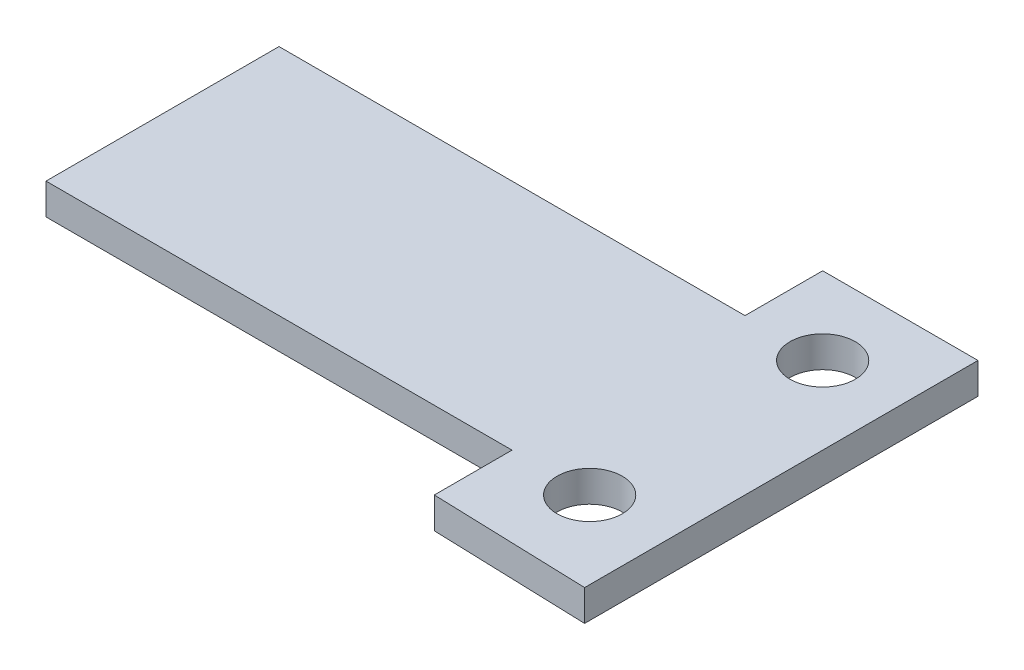
ISO-10303-21;
HEADER;
FILE_DESCRIPTION(('STEP AP214'),'2;1');
FILE_NAME('part.step','',(''),(''),'','','');
FILE_SCHEMA(('AUTOMOTIVE_DESIGN { 1 0 10303 214 1 1 1 1 }'));
ENDSEC;
DATA;
#1=APPLICATION_CONTEXT('core data for automotive mechanical design processes');
#2=APPLICATION_PROTOCOL_DEFINITION('international standard','automotive_design',2000,#1);
#3=PRODUCT_CONTEXT('',#1,'mechanical');
#4=PRODUCT('Part','Part','',(#3));
#5=PRODUCT_RELATED_PRODUCT_CATEGORY('part','',(#4));
#6=PRODUCT_DEFINITION_FORMATION('','',#4);
#7=PRODUCT_DEFINITION_CONTEXT('part definition',#1,'design');
#8=PRODUCT_DEFINITION('design','',#6,#7);
#9=PRODUCT_DEFINITION_SHAPE('','',#8);
#10=(LENGTH_UNIT() NAMED_UNIT(*) SI_UNIT(.MILLI.,.METRE.));
#11=(NAMED_UNIT(*) PLANE_ANGLE_UNIT() SI_UNIT($,.RADIAN.));
#12=(NAMED_UNIT(*) SI_UNIT($,.STERADIAN.) SOLID_ANGLE_UNIT());
#13=UNCERTAINTY_MEASURE_WITH_UNIT(LENGTH_MEASURE(1.E-05),#10,'distance_accuracy_value','');
#14=(GEOMETRIC_REPRESENTATION_CONTEXT(3) GLOBAL_UNCERTAINTY_ASSIGNED_CONTEXT((#13)) GLOBAL_UNIT_ASSIGNED_CONTEXT((#10,
#11,#12)) REPRESENTATION_CONTEXT('',''));
#15=CARTESIAN_POINT('',(0.,0.,0.));
#16=DIRECTION('',(0.,0.,1.));
#17=DIRECTION('',(1.,0.,0.));
#18=AXIS2_PLACEMENT_3D('',#15,#16,#17);
#19=CARTESIAN_POINT('',(0.,2.,0.));
#20=DIRECTION('',(0.,-1.,0.));
#21=DIRECTION('',(0.,0.,-1.));
#22=AXIS2_PLACEMENT_3D('',#19,#20,#21);
#23=PLANE('',#22);
#24=DIRECTION('',(0.,0.,1.));
#25=VECTOR('',#24,1.);
#26=CARTESIAN_POINT('',(-5.,2.,-7.49999999999999));
#27=LINE('',#26,#25);
#28=CARTESIAN_POINT('',(-5.,2.,-12.5));
#29=VERTEX_POINT('',#28);
#30=CARTESIAN_POINT('',(-5.,2.,-7.49999999999999));
#31=VERTEX_POINT('',#30);
#32=EDGE_CURVE('E164',#29,#31,#27,.T.);
#33=ORIENTED_EDGE('',*,*,#32,.T.);
#34=DIRECTION('',(-1.,0.,0.));
#35=VECTOR('',#34,1.);
#36=CARTESIAN_POINT('',(-35.,2.,-7.49999999999999));
#37=LINE('',#36,#35);
#38=CARTESIAN_POINT('',(-35.,2.,-7.49999999999999));
#39=VERTEX_POINT('',#38);
#40=EDGE_CURVE('E100',#31,#39,#37,.T.);
#41=ORIENTED_EDGE('',*,*,#40,.T.);
#42=DIRECTION('',(0.,0.,1.));
#43=VECTOR('',#42,1.);
#44=CARTESIAN_POINT('',(-35.,2.,7.50000000000001));
#45=LINE('',#44,#43);
#46=CARTESIAN_POINT('',(-35.,2.,7.50000000000001));
#47=VERTEX_POINT('',#46);
#48=EDGE_CURVE('E185',#39,#47,#45,.T.);
#49=ORIENTED_EDGE('',*,*,#48,.T.);
#50=DIRECTION('',(1.,0.,0.));
#51=VECTOR('',#50,1.);
#52=CARTESIAN_POINT('',(-5.,2.,7.50000000000001));
#53=LINE('',#52,#51);
#54=CARTESIAN_POINT('',(-5.,2.,7.50000000000001));
#55=VERTEX_POINT('',#54);
#56=EDGE_CURVE('E199',#47,#55,#53,.T.);
#57=ORIENTED_EDGE('',*,*,#56,.T.);
#58=DIRECTION('',(0.,0.,1.));
#59=VECTOR('',#58,1.);
#60=CARTESIAN_POINT('',(-5.,2.,12.5));
#61=LINE('',#60,#59);
#62=CARTESIAN_POINT('',(-5.,2.,12.5));
#63=VERTEX_POINT('',#62);
#64=EDGE_CURVE('E119',#55,#63,#61,.T.);
#65=ORIENTED_EDGE('',*,*,#64,.T.);
#66=DIRECTION('',(0.999467784655394,0.,0.0326212727532165));
#67=VECTOR('',#66,1.);
#68=CARTESIAN_POINT('',(5.,2.,12.8263864354014));
#69=LINE('',#68,#67);
#70=CARTESIAN_POINT('',(5.,2.,12.8263864354014));
#71=VERTEX_POINT('',#70);
#72=EDGE_CURVE('E113',#63,#71,#69,.T.);
#73=ORIENTED_EDGE('',*,*,#72,.T.);
#74=DIRECTION('',(0.,0.,-1.));
#75=VECTOR('',#74,1.);
#76=CARTESIAN_POINT('',(5.,2.,-12.5));
#77=LINE('',#76,#75);
#78=CARTESIAN_POINT('',(5.,2.,-12.5));
#79=VERTEX_POINT('',#78);
#80=EDGE_CURVE('E117',#71,#79,#77,.T.);
#81=ORIENTED_EDGE('',*,*,#80,.T.);
#82=DIRECTION('',(-1.,0.,0.));
#83=VECTOR('',#82,1.);
#84=CARTESIAN_POINT('',(-5.,2.,-12.5));
#85=LINE('',#84,#83);
#86=EDGE_CURVE('E57',#79,#29,#85,.T.);
#87=ORIENTED_EDGE('',*,*,#86,.T.);
#88=EDGE_LOOP('',(#33,#41,#49,#57,#65,#73,#81,#87));
#89=FACE_BOUND('',#88,.T.);
#90=CARTESIAN_POINT('',(0.,2.,-7.5));
#91=DIRECTION('',(0.,1.,0.));
#92=DIRECTION('',(0.,0.,1.));
#93=AXIS2_PLACEMENT_3D('',#90,#91,#92);
#94=CIRCLE('',#93,2.1);
#95=CARTESIAN_POINT('',(0.,2.,-5.4));
#96=VERTEX_POINT('',#95);
#97=EDGE_CURVE('E146',#96,#96,#94,.T.);
#98=ORIENTED_EDGE('',*,*,#97,.F.);
#99=EDGE_LOOP('',(#98));
#100=FACE_BOUND('',#99,.T.);
#101=CARTESIAN_POINT('',(0.,2.,7.50000000000001));
#102=DIRECTION('',(0.,1.,0.));
#103=DIRECTION('',(0.,0.,1.));
#104=AXIS2_PLACEMENT_3D('',#101,#102,#103);
#105=CIRCLE('',#104,2.1);
#106=CARTESIAN_POINT('',(0.,2.,9.6));
#107=VERTEX_POINT('',#106);
#108=EDGE_CURVE('E213',#107,#107,#105,.T.);
#109=ORIENTED_EDGE('',*,*,#108,.F.);
#110=EDGE_LOOP('',(#109));
#111=FACE_BOUND('',#110,.T.);
#112=ADVANCED_FACE('F39',(#89,#100,#111),#23,.F.);
#113=CARTESIAN_POINT('',(0.,0.,0.));
#114=DIRECTION('',(0.,-1.,0.));
#115=DIRECTION('',(0.,0.,-1.));
#116=AXIS2_PLACEMENT_3D('',#113,#114,#115);
#117=PLANE('',#116);
#118=CARTESIAN_POINT('',(0.,0.,-7.5));
#119=DIRECTION('',(0.,1.,0.));
#120=DIRECTION('',(0.,0.,1.));
#121=AXIS2_PLACEMENT_3D('',#118,#119,#120);
#122=CIRCLE('',#121,2.1);
#123=CARTESIAN_POINT('',(0.,0.,-5.4));
#124=VERTEX_POINT('',#123);
#125=EDGE_CURVE('E209',#124,#124,#122,.T.);
#126=ORIENTED_EDGE('',*,*,#125,.T.);
#127=EDGE_LOOP('',(#126));
#128=FACE_BOUND('',#127,.T.);
#129=DIRECTION('',(0.,0.,1.));
#130=VECTOR('',#129,1.);
#131=CARTESIAN_POINT('',(-5.,0.,-7.49999999999999));
#132=LINE('',#131,#130);
#133=CARTESIAN_POINT('',(-5.,0.,-12.5));
#134=VERTEX_POINT('',#133);
#135=CARTESIAN_POINT('',(-5.,0.,-7.49999999999999));
#136=VERTEX_POINT('',#135);
#137=EDGE_CURVE('E141',#134,#136,#132,.T.);
#138=ORIENTED_EDGE('',*,*,#137,.F.);
#139=DIRECTION('',(-1.,0.,0.));
#140=VECTOR('',#139,1.);
#141=CARTESIAN_POINT('',(-5.,0.,-12.5));
#142=LINE('',#141,#140);
#143=CARTESIAN_POINT('',(5.,0.,-12.5));
#144=VERTEX_POINT('',#143);
#145=EDGE_CURVE('E92',#144,#134,#142,.T.);
#146=ORIENTED_EDGE('',*,*,#145,.F.);
#147=DIRECTION('',(0.,0.,-1.));
#148=VECTOR('',#147,1.);
#149=CARTESIAN_POINT('',(5.,0.,-12.5));
#150=LINE('',#149,#148);
#151=CARTESIAN_POINT('',(5.,0.,12.8263864354014));
#152=VERTEX_POINT('',#151);
#153=EDGE_CURVE('E86',#152,#144,#150,.T.);
#154=ORIENTED_EDGE('',*,*,#153,.F.);
#155=DIRECTION('',(0.999467784655394,0.,0.0326212727532165));
#156=VECTOR('',#155,1.);
#157=CARTESIAN_POINT('',(5.,0.,12.8263864354014));
#158=LINE('',#157,#156);
#159=CARTESIAN_POINT('',(-5.,0.,12.5));
#160=VERTEX_POINT('',#159);
#161=EDGE_CURVE('E128',#160,#152,#158,.T.);
#162=ORIENTED_EDGE('',*,*,#161,.F.);
#163=DIRECTION('',(0.,0.,1.));
#164=VECTOR('',#163,1.);
#165=CARTESIAN_POINT('',(-5.,0.,12.5));
#166=LINE('',#165,#164);
#167=CARTESIAN_POINT('',(-5.,0.,7.50000000000001));
#168=VERTEX_POINT('',#167);
#169=EDGE_CURVE('E155',#168,#160,#166,.T.);
#170=ORIENTED_EDGE('',*,*,#169,.F.);
#171=DIRECTION('',(1.,0.,0.));
#172=VECTOR('',#171,1.);
#173=CARTESIAN_POINT('',(-5.,0.,7.50000000000001));
#174=LINE('',#173,#172);
#175=CARTESIAN_POINT('',(-35.,0.,7.50000000000001));
#176=VERTEX_POINT('',#175);
#177=EDGE_CURVE('E152',#176,#168,#174,.T.);
#178=ORIENTED_EDGE('',*,*,#177,.F.);
#179=DIRECTION('',(0.,0.,1.));
#180=VECTOR('',#179,1.);
#181=CARTESIAN_POINT('',(-35.,0.,7.50000000000001));
#182=LINE('',#181,#180);
#183=CARTESIAN_POINT('',(-35.,0.,-7.49999999999999));
#184=VERTEX_POINT('',#183);
#185=EDGE_CURVE('E149',#184,#176,#182,.T.);
#186=ORIENTED_EDGE('',*,*,#185,.F.);
#187=DIRECTION('',(-1.,0.,0.));
#188=VECTOR('',#187,1.);
#189=CARTESIAN_POINT('',(-35.,0.,-7.49999999999999));
#190=LINE('',#189,#188);
#191=EDGE_CURVE('E145',#136,#184,#190,.T.);
#192=ORIENTED_EDGE('',*,*,#191,.F.);
#193=EDGE_LOOP('',(#138,#146,#154,#162,#170,#178,#186,#192));
#194=FACE_BOUND('',#193,.T.);
#195=CARTESIAN_POINT('',(0.,0.,7.50000000000001));
#196=DIRECTION('',(0.,1.,0.));
#197=DIRECTION('',(0.,0.,1.));
#198=AXIS2_PLACEMENT_3D('',#195,#196,#197);
#199=CIRCLE('',#198,2.1);
#200=CARTESIAN_POINT('',(0.,0.,9.6));
#201=VERTEX_POINT('',#200);
#202=EDGE_CURVE('E217',#201,#201,#199,.T.);
#203=ORIENTED_EDGE('',*,*,#202,.T.);
#204=EDGE_LOOP('',(#203));
#205=FACE_BOUND('',#204,.T.);
#206=ADVANCED_FACE('F189',(#128,#194,#205),#117,.T.);
#207=CARTESIAN_POINT('',(-5.,2.,-7.49999999999999));
#208=DIRECTION('',(1.,0.,0.));
#209=DIRECTION('',(0.,0.,-1.));
#210=AXIS2_PLACEMENT_3D('',#207,#208,#209);
#211=PLANE('',#210);
#212=ORIENTED_EDGE('',*,*,#137,.T.);
#213=DIRECTION('',(0.,-1.,0.));
#214=VECTOR('',#213,1.);
#215=CARTESIAN_POINT('',(-5.,2.,-7.49999999999999));
#216=LINE('',#215,#214);
#217=EDGE_CURVE('E11',#31,#136,#216,.T.);
#218=ORIENTED_EDGE('',*,*,#217,.F.);
#219=ORIENTED_EDGE('',*,*,#32,.F.);
#220=DIRECTION('',(0.,-1.,0.));
#221=VECTOR('',#220,1.);
#222=CARTESIAN_POINT('',(-5.,2.,-12.5));
#223=LINE('',#222,#221);
#224=EDGE_CURVE('E137',#29,#134,#223,.T.);
#225=ORIENTED_EDGE('',*,*,#224,.T.);
#226=EDGE_LOOP('',(#212,#218,#219,#225));
#227=FACE_BOUND('',#226,.T.);
#228=ADVANCED_FACE('F41',(#227),#211,.F.);
#229=CARTESIAN_POINT('',(-35.,2.,-7.49999999999999));
#230=DIRECTION('',(0.,0.,1.));
#231=DIRECTION('',(1.,0.,0.));
#232=AXIS2_PLACEMENT_3D('',#229,#230,#231);
#233=PLANE('',#232);
#234=ORIENTED_EDGE('',*,*,#191,.T.);
#235=DIRECTION('',(0.,-1.,0.));
#236=VECTOR('',#235,1.);
#237=CARTESIAN_POINT('',(-35.,2.,-7.49999999999999));
#238=LINE('',#237,#236);
#239=EDGE_CURVE('E49',#39,#184,#238,.T.);
#240=ORIENTED_EDGE('',*,*,#239,.F.);
#241=ORIENTED_EDGE('',*,*,#40,.F.);
#242=ORIENTED_EDGE('',*,*,#217,.T.);
#243=EDGE_LOOP('',(#234,#240,#241,#242));
#244=FACE_BOUND('',#243,.T.);
#245=ADVANCED_FACE('F251',(#244),#233,.F.);
#246=CARTESIAN_POINT('',(-35.,2.,7.50000000000001));
#247=DIRECTION('',(1.,0.,0.));
#248=DIRECTION('',(0.,0.,-1.));
#249=AXIS2_PLACEMENT_3D('',#246,#247,#248);
#250=PLANE('',#249);
#251=ORIENTED_EDGE('',*,*,#185,.T.);
#252=DIRECTION('',(0.,-1.,0.));
#253=VECTOR('',#252,1.);
#254=CARTESIAN_POINT('',(-35.,2.,7.50000000000001));
#255=LINE('',#254,#253);
#256=EDGE_CURVE('E175',#47,#176,#255,.T.);
#257=ORIENTED_EDGE('',*,*,#256,.F.);
#258=ORIENTED_EDGE('',*,*,#48,.F.);
#259=ORIENTED_EDGE('',*,*,#239,.T.);
#260=EDGE_LOOP('',(#251,#257,#258,#259));
#261=FACE_BOUND('',#260,.T.);
#262=ADVANCED_FACE('F183',(#261),#250,.F.);
#263=CARTESIAN_POINT('',(-5.,2.,7.50000000000001));
#264=DIRECTION('',(0.,0.,-1.));
#265=DIRECTION('',(-1.,0.,0.));
#266=AXIS2_PLACEMENT_3D('',#263,#264,#265);
#267=PLANE('',#266);
#268=ORIENTED_EDGE('',*,*,#177,.T.);
#269=DIRECTION('',(0.,-1.,0.));
#270=VECTOR('',#269,1.);
#271=CARTESIAN_POINT('',(-5.,2.,7.50000000000001));
#272=LINE('',#271,#270);
#273=EDGE_CURVE('E171',#55,#168,#272,.T.);
#274=ORIENTED_EDGE('',*,*,#273,.F.);
#275=ORIENTED_EDGE('',*,*,#56,.F.);
#276=ORIENTED_EDGE('',*,*,#256,.T.);
#277=EDGE_LOOP('',(#268,#274,#275,#276));
#278=FACE_BOUND('',#277,.T.);
#279=ADVANCED_FACE('F194',(#278),#267,.F.);
#280=CARTESIAN_POINT('',(-5.,2.,12.5));
#281=DIRECTION('',(1.,0.,0.));
#282=DIRECTION('',(0.,0.,-1.));
#283=AXIS2_PLACEMENT_3D('',#280,#281,#282);
#284=PLANE('',#283);
#285=ORIENTED_EDGE('',*,*,#169,.T.);
#286=DIRECTION('',(0.,-1.,0.));
#287=VECTOR('',#286,1.);
#288=CARTESIAN_POINT('',(-5.,2.,12.5));
#289=LINE('',#288,#287);
#290=EDGE_CURVE('E130',#63,#160,#289,.T.);
#291=ORIENTED_EDGE('',*,*,#290,.F.);
#292=ORIENTED_EDGE('',*,*,#64,.F.);
#293=ORIENTED_EDGE('',*,*,#273,.T.);
#294=EDGE_LOOP('',(#285,#291,#292,#293));
#295=FACE_BOUND('',#294,.T.);
#296=ADVANCED_FACE('F197',(#295),#284,.F.);
#297=CARTESIAN_POINT('',(5.,2.,12.8263864354014));
#298=DIRECTION('',(0.0326212727532165,0.,-0.999467784655394));
#299=DIRECTION('',(-0.999467784655394,0.,-0.0326212727532165));
#300=AXIS2_PLACEMENT_3D('',#297,#298,#299);
#301=PLANE('',#300);
#302=ORIENTED_EDGE('',*,*,#161,.T.);
#303=DIRECTION('',(0.,-1.,0.));
#304=VECTOR('',#303,1.);
#305=CARTESIAN_POINT('',(5.,2.,12.8263864354014));
#306=LINE('',#305,#304);
#307=EDGE_CURVE('E125',#71,#152,#306,.T.);
#308=ORIENTED_EDGE('',*,*,#307,.F.);
#309=ORIENTED_EDGE('',*,*,#72,.F.);
#310=ORIENTED_EDGE('',*,*,#290,.T.);
#311=EDGE_LOOP('',(#302,#308,#309,#310));
#312=FACE_BOUND('',#311,.T.);
#313=ADVANCED_FACE('F126',(#312),#301,.F.);
#314=CARTESIAN_POINT('',(5.,2.,-12.5));
#315=DIRECTION('',(-1.,0.,0.));
#316=DIRECTION('',(0.,0.,1.));
#317=AXIS2_PLACEMENT_3D('',#314,#315,#316);
#318=PLANE('',#317);
#319=ORIENTED_EDGE('',*,*,#153,.T.);
#320=DIRECTION('',(0.,-1.,0.));
#321=VECTOR('',#320,1.);
#322=CARTESIAN_POINT('',(5.,2.,-12.5));
#323=LINE('',#322,#321);
#324=EDGE_CURVE('E131',#79,#144,#323,.T.);
#325=ORIENTED_EDGE('',*,*,#324,.F.);
#326=ORIENTED_EDGE('',*,*,#80,.F.);
#327=ORIENTED_EDGE('',*,*,#307,.T.);
#328=EDGE_LOOP('',(#319,#325,#326,#327));
#329=FACE_BOUND('',#328,.T.);
#330=ADVANCED_FACE('F133',(#329),#318,.F.);
#331=CARTESIAN_POINT('',(-5.,2.,-12.5));
#332=DIRECTION('',(0.,0.,1.));
#333=DIRECTION('',(1.,0.,0.));
#334=AXIS2_PLACEMENT_3D('',#331,#332,#333);
#335=PLANE('',#334);
#336=ORIENTED_EDGE('',*,*,#145,.T.);
#337=ORIENTED_EDGE('',*,*,#224,.F.);
#338=ORIENTED_EDGE('',*,*,#86,.F.);
#339=ORIENTED_EDGE('',*,*,#324,.T.);
#340=EDGE_LOOP('',(#336,#337,#338,#339));
#341=FACE_BOUND('',#340,.T.);
#342=ADVANCED_FACE('F239',(#341),#335,.F.);
#343=CARTESIAN_POINT('',(0.,2.,-7.5));
#344=DIRECTION('',(0.,-1.,0.));
#345=DIRECTION('',(0.,0.,-1.));
#346=AXIS2_PLACEMENT_3D('',#343,#344,#345);
#347=CYLINDRICAL_SURFACE('',#346,2.1);
#348=ORIENTED_EDGE('',*,*,#97,.T.);
#349=EDGE_LOOP('',(#348));
#350=FACE_BOUND('',#349,.T.);
#351=ORIENTED_EDGE('',*,*,#125,.F.);
#352=EDGE_LOOP('',(#351));
#353=FACE_BOUND('',#352,.T.);
#354=ADVANCED_FACE('F236',(#350,#353),#347,.F.);
#355=CARTESIAN_POINT('',(0.,2.,7.50000000000001));
#356=DIRECTION('',(0.,-1.,0.));
#357=DIRECTION('',(0.,0.,-1.));
#358=AXIS2_PLACEMENT_3D('',#355,#356,#357);
#359=CYLINDRICAL_SURFACE('',#358,2.1);
#360=ORIENTED_EDGE('',*,*,#108,.T.);
#361=EDGE_LOOP('',(#360));
#362=FACE_BOUND('',#361,.T.);
#363=ORIENTED_EDGE('',*,*,#202,.F.);
#364=EDGE_LOOP('',(#363));
#365=FACE_BOUND('',#364,.T.);
#366=ADVANCED_FACE('F225',(#362,#365),#359,.F.);
#367=CLOSED_SHELL('',(#112,#206,#228,#245,#262,#279,#296,#313,#330,#342,#354,#366));
#368=MANIFOLD_SOLID_BREP('B2',#367);
#369=ADVANCED_BREP_SHAPE_REPRESENTATION('',(#18,#368),#14);
#370=SHAPE_DEFINITION_REPRESENTATION(#9,#369);
ENDSEC;
END-ISO-10303-21;
